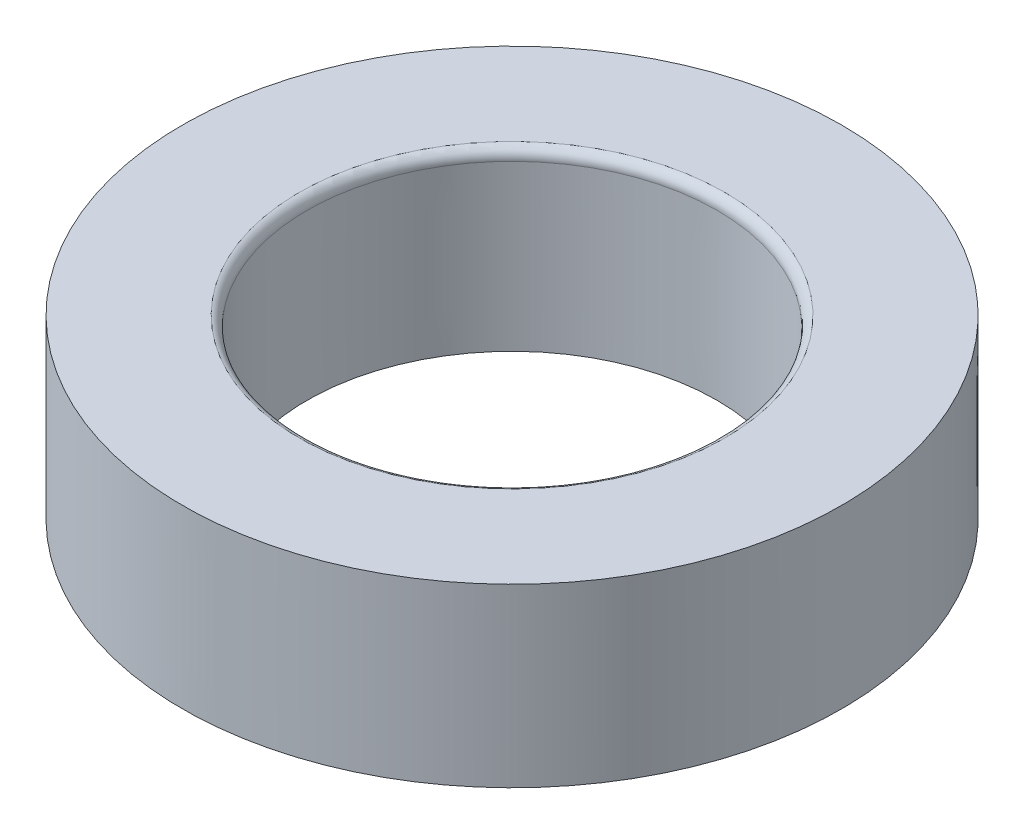
ISO-10303-21;
HEADER;
FILE_DESCRIPTION(('STEP AP214'),'2;1');
FILE_NAME('part.step','',(''),(''),'','','');
FILE_SCHEMA(('AUTOMOTIVE_DESIGN { 1 0 10303 214 1 1 1 1 }'));
ENDSEC;
DATA;
#1=APPLICATION_CONTEXT('core data for automotive mechanical design processes');
#2=APPLICATION_PROTOCOL_DEFINITION('international standard','automotive_design',2000,#1);
#3=PRODUCT_CONTEXT('',#1,'mechanical');
#4=PRODUCT('Part','Part','',(#3));
#5=PRODUCT_RELATED_PRODUCT_CATEGORY('part','',(#4));
#6=PRODUCT_DEFINITION_FORMATION('','',#4);
#7=PRODUCT_DEFINITION_CONTEXT('part definition',#1,'design');
#8=PRODUCT_DEFINITION('design','',#6,#7);
#9=PRODUCT_DEFINITION_SHAPE('','',#8);
#10=(LENGTH_UNIT() NAMED_UNIT(*) SI_UNIT(.MILLI.,.METRE.));
#11=(NAMED_UNIT(*) PLANE_ANGLE_UNIT() SI_UNIT($,.RADIAN.));
#12=(NAMED_UNIT(*) SI_UNIT($,.STERADIAN.) SOLID_ANGLE_UNIT());
#13=UNCERTAINTY_MEASURE_WITH_UNIT(LENGTH_MEASURE(1.E-05),#10,'distance_accuracy_value','');
#14=(GEOMETRIC_REPRESENTATION_CONTEXT(3) GLOBAL_UNCERTAINTY_ASSIGNED_CONTEXT((#13)) GLOBAL_UNIT_ASSIGNED_CONTEXT((#10,
#11,#12)) REPRESENTATION_CONTEXT('',''));
#15=CARTESIAN_POINT('',(0.,0.,0.));
#16=DIRECTION('',(0.,0.,1.));
#17=DIRECTION('',(1.,0.,0.));
#18=AXIS2_PLACEMENT_3D('',#15,#16,#17);
#19=CARTESIAN_POINT('',(0.,0.000589829843522516,0.));
#20=DIRECTION('',(0.,1.,0.));
#21=DIRECTION('',(0.,0.,1.));
#22=AXIS2_PLACEMENT_3D('',#19,#20,#21);
#23=CONICAL_SURFACE('',#22,15.9662788206567,1.57069855014816);
#24=CARTESIAN_POINT('',(0.,0.,0.));
#25=DIRECTION('',(0.,-1.,0.));
#26=DIRECTION('',(0.,0.,-1.));
#27=AXIS2_PLACEMENT_3D('',#24,#25,#26);
#28=CIRCLE('',#27,9.93385838752228);
#29=CARTESIAN_POINT('',(0.,0.,-9.93385838752228));
#30=VERTEX_POINT('',#29);
#31=EDGE_CURVE('E49',#30,#30,#28,.T.);
#32=ORIENTED_EDGE('',*,*,#31,.F.);
#33=EDGE_LOOP('',(#32));
#34=FACE_BOUND('',#33,.T.);
#35=CARTESIAN_POINT('',(0.,0.000589829843522516,0.));
#36=DIRECTION('',(0.,-1.,0.));
#37=DIRECTION('',(0.,0.,-1.));
#38=AXIS2_PLACEMENT_3D('',#35,#36,#37);
#39=CIRCLE('',#38,15.9662788206567);
#40=CARTESIAN_POINT('',(0.,0.000589829843522516,-15.9662788206567));
#41=VERTEX_POINT('',#40);
#42=EDGE_CURVE('E10',#41,#41,#39,.T.);
#43=ORIENTED_EDGE('',*,*,#42,.T.);
#44=EDGE_LOOP('',(#43));
#45=FACE_BOUND('',#44,.T.);
#46=ADVANCED_FACE('F30',(#34,#45),#23,.T.);
#47=CARTESIAN_POINT('',(0.,8.53934804367074,0.));
#48=DIRECTION('',(0.,-1.,0.));
#49=DIRECTION('',(0.,0.,-1.));
#50=AXIS2_PLACEMENT_3D('',#47,#48,#49);
#51=CONICAL_SURFACE('',#50,15.9654439295086,9.77766467343547E-05);
#52=ORIENTED_EDGE('',*,*,#42,.F.);
#53=EDGE_LOOP('',(#52));
#54=FACE_BOUND('',#53,.T.);
#55=CARTESIAN_POINT('',(0.,8.53934804367074,0.));
#56=DIRECTION('',(0.,-1.,0.));
#57=DIRECTION('',(0.,0.,-1.));
#58=AXIS2_PLACEMENT_3D('',#55,#56,#57);
#59=CIRCLE('',#58,15.9654439295086);
#60=CARTESIAN_POINT('',(0.,8.53934804367074,-15.9654439295086));
#61=VERTEX_POINT('',#60);
#62=EDGE_CURVE('E36',#61,#61,#59,.T.);
#63=ORIENTED_EDGE('',*,*,#62,.T.);
#64=EDGE_LOOP('',(#63));
#65=FACE_BOUND('',#64,.T.);
#66=ADVANCED_FACE('F56',(#54,#65),#51,.T.);
#67=CARTESIAN_POINT('',(0.,8.53879499590277,0.));
#68=DIRECTION('',(0.,1.,0.));
#69=DIRECTION('',(0.,0.,1.));
#70=AXIS2_PLACEMENT_3D('',#67,#68,#69);
#71=CONICAL_SURFACE('',#70,10.3092081647703,1.57069855014816);
#72=ORIENTED_EDGE('',*,*,#62,.F.);
#73=EDGE_LOOP('',(#72));
#74=FACE_BOUND('',#73,.T.);
#75=CARTESIAN_POINT('',(0.,8.53879499590277,0.));
#76=DIRECTION('',(0.,-1.,0.));
#77=DIRECTION('',(0.,0.,-1.));
#78=AXIS2_PLACEMENT_3D('',#75,#76,#77);
#79=CIRCLE('',#78,10.3092081647703);
#80=CARTESIAN_POINT('',(0.,8.53879499590277,-10.3092081647703));
#81=VERTEX_POINT('',#80);
#82=EDGE_CURVE('E40',#81,#81,#79,.T.);
#83=ORIENTED_EDGE('',*,*,#82,.T.);
#84=EDGE_LOOP('',(#83));
#85=FACE_BOUND('',#84,.T.);
#86=ADVANCED_FACE('F60',(#74,#85),#71,.F.);
#87=CARTESIAN_POINT('',(0.,8.05470916224937,0.));
#88=DIRECTION('',(0.,-1.,0.));
#89=DIRECTION('',(0.,0.,-1.));
#90=AXIS2_PLACEMENT_3D('',#87,#88,#89);
#91=TOROIDAL_SURFACE('',#90,10.4227663442269,0.497226864183152);
#92=ORIENTED_EDGE('',*,*,#82,.F.);
#93=EDGE_LOOP('',(#92));
#94=FACE_BOUND('',#93,.T.);
#95=CARTESIAN_POINT('',(0.,7.96844727330933,0.));
#96=DIRECTION('',(0.,-1.,0.));
#97=DIRECTION('',(0.,0.,-1.));
#98=AXIS2_PLACEMENT_3D('',#95,#96,#97);
#99=CIRCLE('',#98,9.9330792594657);
#100=CARTESIAN_POINT('',(0.,7.96844727330933,-9.9330792594657));
#101=VERTEX_POINT('',#100);
#102=EDGE_CURVE('E44',#101,#101,#99,.T.);
#103=ORIENTED_EDGE('',*,*,#102,.T.);
#104=EDGE_LOOP('',(#103));
#105=FACE_BOUND('',#104,.T.);
#106=ADVANCED_FACE('F65',(#94,#105),#91,.T.);
#107=CARTESIAN_POINT('',(0.,0.,0.));
#108=DIRECTION('',(0.,-1.,0.));
#109=DIRECTION('',(0.,0.,-1.));
#110=AXIS2_PLACEMENT_3D('',#107,#108,#109);
#111=CONICAL_SURFACE('',#110,9.93385838752228,9.77766467379354E-05);
#112=ORIENTED_EDGE('',*,*,#102,.F.);
#113=EDGE_LOOP('',(#112));
#114=FACE_BOUND('',#113,.T.);
#115=ORIENTED_EDGE('',*,*,#31,.T.);
#116=EDGE_LOOP('',(#115));
#117=FACE_BOUND('',#116,.T.);
#118=ADVANCED_FACE('F53',(#114,#117),#111,.F.);
#119=CLOSED_SHELL('',(#46,#66,#86,#106,#118));
#120=MANIFOLD_SOLID_BREP('B2',#119);
#121=ADVANCED_BREP_SHAPE_REPRESENTATION('',(#18,#120),#14);
#122=SHAPE_DEFINITION_REPRESENTATION(#9,#121);
ENDSEC;
END-ISO-10303-21;
